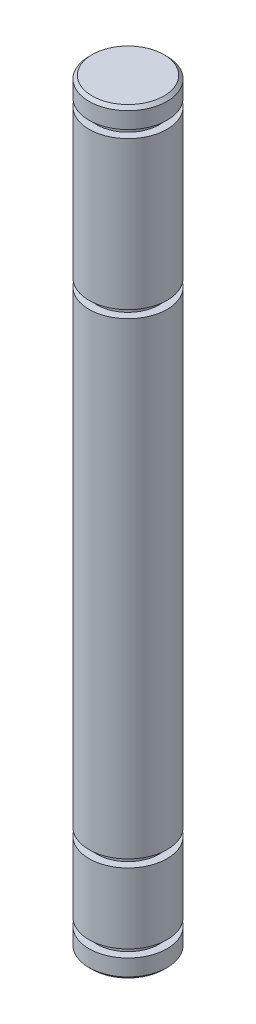
ISO-10303-21;
HEADER;
FILE_DESCRIPTION(('STEP AP214'),'2;1');
FILE_NAME('part.step','',(''),(''),'','','');
FILE_SCHEMA(('AUTOMOTIVE_DESIGN { 1 0 10303 214 1 1 1 1 }'));
ENDSEC;
DATA;
#1=APPLICATION_CONTEXT('core data for automotive mechanical design processes');
#2=APPLICATION_PROTOCOL_DEFINITION('international standard','automotive_design',2000,#1);
#3=PRODUCT_CONTEXT('',#1,'mechanical');
#4=PRODUCT('Part','Part','',(#3));
#5=PRODUCT_RELATED_PRODUCT_CATEGORY('part','',(#4));
#6=PRODUCT_DEFINITION_FORMATION('','',#4);
#7=PRODUCT_DEFINITION_CONTEXT('part definition',#1,'design');
#8=PRODUCT_DEFINITION('design','',#6,#7);
#9=PRODUCT_DEFINITION_SHAPE('','',#8);
#10=(LENGTH_UNIT() NAMED_UNIT(*) SI_UNIT(.MILLI.,.METRE.));
#11=(NAMED_UNIT(*) PLANE_ANGLE_UNIT() SI_UNIT($,.RADIAN.));
#12=(NAMED_UNIT(*) SI_UNIT($,.STERADIAN.) SOLID_ANGLE_UNIT());
#13=UNCERTAINTY_MEASURE_WITH_UNIT(LENGTH_MEASURE(1.E-05),#10,'distance_accuracy_value','');
#14=(GEOMETRIC_REPRESENTATION_CONTEXT(3) GLOBAL_UNCERTAINTY_ASSIGNED_CONTEXT((#13)) GLOBAL_UNIT_ASSIGNED_CONTEXT((#10,
#11,#12)) REPRESENTATION_CONTEXT('',''));
#15=CARTESIAN_POINT('',(0.,0.,0.));
#16=DIRECTION('',(0.,0.,1.));
#17=DIRECTION('',(1.,0.,0.));
#18=AXIS2_PLACEMENT_3D('',#15,#16,#17);
#19=CARTESIAN_POINT('',(5.84200000000003,-61.595,0.));
#20=DIRECTION('',(0.,-1.,0.));
#21=DIRECTION('',(1.,0.,0.));
#22=AXIS2_PLACEMENT_3D('',#19,#20,#21);
#23=PLANE('',#22);
#24=CARTESIAN_POINT('',(0.,-61.595,0.));
#25=DIRECTION('',(0.,-1.,0.));
#26=DIRECTION('',(1.,0.,0.));
#27=AXIS2_PLACEMENT_3D('',#24,#25,#26);
#28=CIRCLE('',#27,5.842);
#29=CARTESIAN_POINT('',(5.84200000000003,-61.595,0.));
#30=VERTEX_POINT('',#29);
#31=EDGE_CURVE('E12',#30,#30,#28,.T.);
#32=ORIENTED_EDGE('',*,*,#31,.T.);
#33=EDGE_LOOP('',(#32));
#34=FACE_BOUND('',#33,.T.);
#35=ADVANCED_FACE('F39',(#34),#23,.T.);
#36=CARTESIAN_POINT('',(0.,-61.595,0.));
#37=DIRECTION('',(0.,1.,0.));
#38=DIRECTION('',(-1.,0.,0.));
#39=AXIS2_PLACEMENT_3D('',#36,#37,#38);
#40=CONICAL_SURFACE('',#39,5.842,0.785398163397433);
#41=CARTESIAN_POINT('',(0.,-61.087,0.));
#42=DIRECTION('',(0.,-1.,0.));
#43=DIRECTION('',(1.,0.,0.));
#44=AXIS2_PLACEMENT_3D('',#41,#42,#43);
#45=CIRCLE('',#44,6.34999999999999);
#46=CARTESIAN_POINT('',(6.35000000000001,-61.087,0.));
#47=VERTEX_POINT('',#46);
#48=EDGE_CURVE('E45',#47,#47,#45,.T.);
#49=ORIENTED_EDGE('',*,*,#48,.T.);
#50=EDGE_LOOP('',(#49));
#51=FACE_BOUND('',#50,.T.);
#52=ORIENTED_EDGE('',*,*,#31,.F.);
#53=EDGE_LOOP('',(#52));
#54=FACE_BOUND('',#53,.T.);
#55=ADVANCED_FACE('F119',(#51,#54),#40,.T.);
#56=CARTESIAN_POINT('',(0.,-61.595,0.));
#57=DIRECTION('',(0.,-1.,0.));
#58=DIRECTION('',(1.,0.,0.));
#59=AXIS2_PLACEMENT_3D('',#56,#57,#58);
#60=CYLINDRICAL_SURFACE('',#59,6.34999999999999);
#61=CARTESIAN_POINT('',(0.,-58.42,0.));
#62=DIRECTION('',(0.,-1.,0.));
#63=DIRECTION('',(1.,0.,0.));
#64=AXIS2_PLACEMENT_3D('',#61,#62,#63);
#65=CIRCLE('',#64,6.34999999999999);
#66=CARTESIAN_POINT('',(6.35000000000001,-58.42,0.));
#67=VERTEX_POINT('',#66);
#68=EDGE_CURVE('E49',#67,#67,#65,.T.);
#69=ORIENTED_EDGE('',*,*,#68,.T.);
#70=EDGE_LOOP('',(#69));
#71=FACE_BOUND('',#70,.T.);
#72=ORIENTED_EDGE('',*,*,#48,.F.);
#73=EDGE_LOOP('',(#72));
#74=FACE_BOUND('',#73,.T.);
#75=ADVANCED_FACE('F123',(#71,#74),#60,.T.);
#76=CARTESIAN_POINT('',(6.35000000000001,-58.42,0.));
#77=DIRECTION('',(0.,1.,0.));
#78=DIRECTION('',(-1.,0.,0.));
#79=AXIS2_PLACEMENT_3D('',#76,#77,#78);
#80=PLANE('',#79);
#81=CARTESIAN_POINT('',(0.,-58.42,0.));
#82=DIRECTION('',(0.,-1.,0.));
#83=DIRECTION('',(1.,0.,0.));
#84=AXIS2_PLACEMENT_3D('',#81,#82,#83);
#85=CIRCLE('',#84,5.07999999999989);
#86=CARTESIAN_POINT('',(5.07999999999991,-58.42,0.));
#87=VERTEX_POINT('',#86);
#88=EDGE_CURVE('E53',#87,#87,#85,.T.);
#89=ORIENTED_EDGE('',*,*,#88,.T.);
#90=EDGE_LOOP('',(#89));
#91=FACE_BOUND('',#90,.T.);
#92=ORIENTED_EDGE('',*,*,#68,.F.);
#93=EDGE_LOOP('',(#92));
#94=FACE_BOUND('',#93,.T.);
#95=ADVANCED_FACE('F127',(#91,#94),#80,.T.);
#96=CARTESIAN_POINT('',(0.,-61.595,0.));
#97=DIRECTION('',(0.,-1.,0.));
#98=DIRECTION('',(1.,0.,0.));
#99=AXIS2_PLACEMENT_3D('',#96,#97,#98);
#100=CYLINDRICAL_SURFACE('',#99,5.07999999999988);
#101=CARTESIAN_POINT('',(0.,-57.15,0.));
#102=DIRECTION('',(0.,-1.,0.));
#103=DIRECTION('',(1.,0.,0.));
#104=AXIS2_PLACEMENT_3D('',#101,#102,#103);
#105=CIRCLE('',#104,5.07999999999989);
#106=CARTESIAN_POINT('',(5.07999999999991,-57.15,0.));
#107=VERTEX_POINT('',#106);
#108=EDGE_CURVE('E58',#107,#107,#105,.T.);
#109=ORIENTED_EDGE('',*,*,#108,.T.);
#110=EDGE_LOOP('',(#109));
#111=FACE_BOUND('',#110,.T.);
#112=ORIENTED_EDGE('',*,*,#88,.F.);
#113=EDGE_LOOP('',(#112));
#114=FACE_BOUND('',#113,.T.);
#115=ADVANCED_FACE('F134',(#111,#114),#100,.T.);
#116=CARTESIAN_POINT('',(6.35000000000001,-57.15,0.));
#117=DIRECTION('',(0.,-1.,0.));
#118=DIRECTION('',(1.,0.,0.));
#119=AXIS2_PLACEMENT_3D('',#116,#117,#118);
#120=PLANE('',#119);
#121=CARTESIAN_POINT('',(0.,-57.15,0.));
#122=DIRECTION('',(0.,-1.,0.));
#123=DIRECTION('',(1.,0.,0.));
#124=AXIS2_PLACEMENT_3D('',#121,#122,#123);
#125=CIRCLE('',#124,6.34999999999999);
#126=CARTESIAN_POINT('',(6.35000000000001,-57.15,0.));
#127=VERTEX_POINT('',#126);
#128=EDGE_CURVE('E61',#127,#127,#125,.T.);
#129=ORIENTED_EDGE('',*,*,#128,.T.);
#130=EDGE_LOOP('',(#129));
#131=FACE_BOUND('',#130,.T.);
#132=ORIENTED_EDGE('',*,*,#108,.F.);
#133=EDGE_LOOP('',(#132));
#134=FACE_BOUND('',#133,.T.);
#135=ADVANCED_FACE('F138',(#131,#134),#120,.T.);
#136=CARTESIAN_POINT('',(0.,-61.595,0.));
#137=DIRECTION('',(0.,-1.,0.));
#138=DIRECTION('',(1.,0.,0.));
#139=AXIS2_PLACEMENT_3D('',#136,#137,#138);
#140=CYLINDRICAL_SURFACE('',#139,6.34999999999999);
#141=CARTESIAN_POINT('',(0.,-45.72,0.));
#142=DIRECTION('',(0.,-1.,0.));
#143=DIRECTION('',(1.,0.,0.));
#144=AXIS2_PLACEMENT_3D('',#141,#142,#143);
#145=CIRCLE('',#144,6.35);
#146=CARTESIAN_POINT('',(6.35000000000003,-45.72,0.));
#147=VERTEX_POINT('',#146);
#148=EDGE_CURVE('E64',#147,#147,#145,.T.);
#149=ORIENTED_EDGE('',*,*,#148,.T.);
#150=EDGE_LOOP('',(#149));
#151=FACE_BOUND('',#150,.T.);
#152=ORIENTED_EDGE('',*,*,#128,.F.);
#153=EDGE_LOOP('',(#152));
#154=FACE_BOUND('',#153,.T.);
#155=ADVANCED_FACE('F142',(#151,#154),#140,.T.);
#156=CARTESIAN_POINT('',(6.35000000000003,-45.72,0.));
#157=DIRECTION('',(0.,1.,0.));
#158=DIRECTION('',(-1.,0.,0.));
#159=AXIS2_PLACEMENT_3D('',#156,#157,#158);
#160=PLANE('',#159);
#161=CARTESIAN_POINT('',(0.,-45.72,0.));
#162=DIRECTION('',(0.,-1.,0.));
#163=DIRECTION('',(1.,0.,0.));
#164=AXIS2_PLACEMENT_3D('',#161,#162,#163);
#165=CIRCLE('',#164,5.07999999999989);
#166=CARTESIAN_POINT('',(5.07999999999991,-45.72,0.));
#167=VERTEX_POINT('',#166);
#168=EDGE_CURVE('E67',#167,#167,#165,.T.);
#169=ORIENTED_EDGE('',*,*,#168,.T.);
#170=EDGE_LOOP('',(#169));
#171=FACE_BOUND('',#170,.T.);
#172=ORIENTED_EDGE('',*,*,#148,.F.);
#173=EDGE_LOOP('',(#172));
#174=FACE_BOUND('',#173,.T.);
#175=ADVANCED_FACE('F146',(#171,#174),#160,.T.);
#176=CARTESIAN_POINT('',(0.,-61.595,0.));
#177=DIRECTION('',(0.,-1.,0.));
#178=DIRECTION('',(1.,0.,0.));
#179=AXIS2_PLACEMENT_3D('',#176,#177,#178);
#180=CYLINDRICAL_SURFACE('',#179,5.07999999999989);
#181=CARTESIAN_POINT('',(0.,-44.45,0.));
#182=DIRECTION('',(0.,-1.,0.));
#183=DIRECTION('',(1.,0.,0.));
#184=AXIS2_PLACEMENT_3D('',#181,#182,#183);
#185=CIRCLE('',#184,5.07999999999989);
#186=CARTESIAN_POINT('',(5.07999999999991,-44.45,0.));
#187=VERTEX_POINT('',#186);
#188=EDGE_CURVE('E70',#187,#187,#185,.T.);
#189=ORIENTED_EDGE('',*,*,#188,.T.);
#190=EDGE_LOOP('',(#189));
#191=FACE_BOUND('',#190,.T.);
#192=ORIENTED_EDGE('',*,*,#168,.F.);
#193=EDGE_LOOP('',(#192));
#194=FACE_BOUND('',#193,.T.);
#195=ADVANCED_FACE('F150',(#191,#194),#180,.T.);
#196=CARTESIAN_POINT('',(6.35000000000001,-44.45,0.));
#197=DIRECTION('',(0.,-1.,0.));
#198=DIRECTION('',(1.,0.,0.));
#199=AXIS2_PLACEMENT_3D('',#196,#197,#198);
#200=PLANE('',#199);
#201=CARTESIAN_POINT('',(0.,-44.45,0.));
#202=DIRECTION('',(0.,-1.,0.));
#203=DIRECTION('',(1.,0.,0.));
#204=AXIS2_PLACEMENT_3D('',#201,#202,#203);
#205=CIRCLE('',#204,6.34999999999999);
#206=CARTESIAN_POINT('',(6.35000000000001,-44.45,0.));
#207=VERTEX_POINT('',#206);
#208=EDGE_CURVE('E73',#207,#207,#205,.T.);
#209=ORIENTED_EDGE('',*,*,#208,.T.);
#210=EDGE_LOOP('',(#209));
#211=FACE_BOUND('',#210,.T.);
#212=ORIENTED_EDGE('',*,*,#188,.F.);
#213=EDGE_LOOP('',(#212));
#214=FACE_BOUND('',#213,.T.);
#215=ADVANCED_FACE('F154',(#211,#214),#200,.T.);
#216=CARTESIAN_POINT('',(0.,-61.595,0.));
#217=DIRECTION('',(0.,-1.,0.));
#218=DIRECTION('',(1.,0.,0.));
#219=AXIS2_PLACEMENT_3D('',#216,#217,#218);
#220=CYLINDRICAL_SURFACE('',#219,6.35);
#221=CARTESIAN_POINT('',(0.,31.75,0.));
#222=DIRECTION('',(0.,-1.,0.));
#223=DIRECTION('',(1.,0.,0.));
#224=AXIS2_PLACEMENT_3D('',#221,#222,#223);
#225=CIRCLE('',#224,6.35000000000001);
#226=CARTESIAN_POINT('',(6.35000000000002,31.75,0.));
#227=VERTEX_POINT('',#226);
#228=EDGE_CURVE('E76',#227,#227,#225,.T.);
#229=ORIENTED_EDGE('',*,*,#228,.T.);
#230=EDGE_LOOP('',(#229));
#231=FACE_BOUND('',#230,.T.);
#232=ORIENTED_EDGE('',*,*,#208,.F.);
#233=EDGE_LOOP('',(#232));
#234=FACE_BOUND('',#233,.T.);
#235=ADVANCED_FACE('F158',(#231,#234),#220,.T.);
#236=CARTESIAN_POINT('',(6.35000000000002,31.75,0.));
#237=DIRECTION('',(0.,1.,0.));
#238=DIRECTION('',(-1.,0.,0.));
#239=AXIS2_PLACEMENT_3D('',#236,#237,#238);
#240=PLANE('',#239);
#241=CARTESIAN_POINT('',(0.,31.75,0.));
#242=DIRECTION('',(0.,-1.,0.));
#243=DIRECTION('',(1.,0.,0.));
#244=AXIS2_PLACEMENT_3D('',#241,#242,#243);
#245=CIRCLE('',#244,5.07999999999991);
#246=CARTESIAN_POINT('',(5.07999999999992,31.75,0.));
#247=VERTEX_POINT('',#246);
#248=EDGE_CURVE('E79',#247,#247,#245,.T.);
#249=ORIENTED_EDGE('',*,*,#248,.T.);
#250=EDGE_LOOP('',(#249));
#251=FACE_BOUND('',#250,.T.);
#252=ORIENTED_EDGE('',*,*,#228,.F.);
#253=EDGE_LOOP('',(#252));
#254=FACE_BOUND('',#253,.T.);
#255=ADVANCED_FACE('F162',(#251,#254),#240,.T.);
#256=CARTESIAN_POINT('',(0.,-61.595,0.));
#257=DIRECTION('',(0.,-1.,0.));
#258=DIRECTION('',(1.,0.,0.));
#259=AXIS2_PLACEMENT_3D('',#256,#257,#258);
#260=CYLINDRICAL_SURFACE('',#259,5.07999999999991);
#261=CARTESIAN_POINT('',(0.,33.02,0.));
#262=DIRECTION('',(0.,-1.,0.));
#263=DIRECTION('',(1.,0.,0.));
#264=AXIS2_PLACEMENT_3D('',#261,#262,#263);
#265=CIRCLE('',#264,5.07999999999991);
#266=CARTESIAN_POINT('',(5.07999999999992,33.02,0.));
#267=VERTEX_POINT('',#266);
#268=EDGE_CURVE('E82',#267,#267,#265,.T.);
#269=ORIENTED_EDGE('',*,*,#268,.T.);
#270=EDGE_LOOP('',(#269));
#271=FACE_BOUND('',#270,.T.);
#272=ORIENTED_EDGE('',*,*,#248,.F.);
#273=EDGE_LOOP('',(#272));
#274=FACE_BOUND('',#273,.T.);
#275=ADVANCED_FACE('F166',(#271,#274),#260,.T.);
#276=CARTESIAN_POINT('',(6.35000000000002,33.02,0.));
#277=DIRECTION('',(0.,-1.,0.));
#278=DIRECTION('',(1.,0.,0.));
#279=AXIS2_PLACEMENT_3D('',#276,#277,#278);
#280=PLANE('',#279);
#281=CARTESIAN_POINT('',(0.,33.02,0.));
#282=DIRECTION('',(0.,-1.,0.));
#283=DIRECTION('',(1.,0.,0.));
#284=AXIS2_PLACEMENT_3D('',#281,#282,#283);
#285=CIRCLE('',#284,6.35000000000001);
#286=CARTESIAN_POINT('',(6.35000000000002,33.02,0.));
#287=VERTEX_POINT('',#286);
#288=EDGE_CURVE('E85',#287,#287,#285,.T.);
#289=ORIENTED_EDGE('',*,*,#288,.T.);
#290=EDGE_LOOP('',(#289));
#291=FACE_BOUND('',#290,.T.);
#292=ORIENTED_EDGE('',*,*,#268,.F.);
#293=EDGE_LOOP('',(#292));
#294=FACE_BOUND('',#293,.T.);
#295=ADVANCED_FACE('F170',(#291,#294),#280,.T.);
#296=CARTESIAN_POINT('',(0.,-61.595,0.));
#297=DIRECTION('',(0.,-1.,0.));
#298=DIRECTION('',(1.,0.,0.));
#299=AXIS2_PLACEMENT_3D('',#296,#297,#298);
#300=CYLINDRICAL_SURFACE('',#299,6.35000000000001);
#301=CARTESIAN_POINT('',(0.,57.15,0.));
#302=DIRECTION('',(0.,-1.,0.));
#303=DIRECTION('',(1.,0.,0.));
#304=AXIS2_PLACEMENT_3D('',#301,#302,#303);
#305=CIRCLE('',#304,6.35000000000001);
#306=CARTESIAN_POINT('',(6.35000000000002,57.15,0.));
#307=VERTEX_POINT('',#306);
#308=EDGE_CURVE('E88',#307,#307,#305,.T.);
#309=ORIENTED_EDGE('',*,*,#308,.T.);
#310=EDGE_LOOP('',(#309));
#311=FACE_BOUND('',#310,.T.);
#312=ORIENTED_EDGE('',*,*,#288,.F.);
#313=EDGE_LOOP('',(#312));
#314=FACE_BOUND('',#313,.T.);
#315=ADVANCED_FACE('F174',(#311,#314),#300,.T.);
#316=CARTESIAN_POINT('',(6.35000000000002,57.15,0.));
#317=DIRECTION('',(0.,1.,0.));
#318=DIRECTION('',(-1.,0.,0.));
#319=AXIS2_PLACEMENT_3D('',#316,#317,#318);
#320=PLANE('',#319);
#321=CARTESIAN_POINT('',(0.,57.15,0.));
#322=DIRECTION('',(0.,-1.,0.));
#323=DIRECTION('',(1.,0.,0.));
#324=AXIS2_PLACEMENT_3D('',#321,#322,#323);
#325=CIRCLE('',#324,5.07999999999992);
#326=CARTESIAN_POINT('',(5.07999999999992,57.15,0.));
#327=VERTEX_POINT('',#326);
#328=EDGE_CURVE('E91',#327,#327,#325,.T.);
#329=ORIENTED_EDGE('',*,*,#328,.T.);
#330=EDGE_LOOP('',(#329));
#331=FACE_BOUND('',#330,.T.);
#332=ORIENTED_EDGE('',*,*,#308,.F.);
#333=EDGE_LOOP('',(#332));
#334=FACE_BOUND('',#333,.T.);
#335=ADVANCED_FACE('F178',(#331,#334),#320,.T.);
#336=CARTESIAN_POINT('',(0.,-61.595,0.));
#337=DIRECTION('',(0.,-1.,0.));
#338=DIRECTION('',(1.,0.,0.));
#339=AXIS2_PLACEMENT_3D('',#336,#337,#338);
#340=CYLINDRICAL_SURFACE('',#339,5.07999999999992);
#341=CARTESIAN_POINT('',(0.,58.42,0.));
#342=DIRECTION('',(0.,-1.,0.));
#343=DIRECTION('',(1.,0.,0.));
#344=AXIS2_PLACEMENT_3D('',#341,#342,#343);
#345=CIRCLE('',#344,5.07999999999994);
#346=CARTESIAN_POINT('',(5.07999999999994,58.42,0.));
#347=VERTEX_POINT('',#346);
#348=EDGE_CURVE('E94',#347,#347,#345,.T.);
#349=ORIENTED_EDGE('',*,*,#348,.T.);
#350=EDGE_LOOP('',(#349));
#351=FACE_BOUND('',#350,.T.);
#352=ORIENTED_EDGE('',*,*,#328,.F.);
#353=EDGE_LOOP('',(#352));
#354=FACE_BOUND('',#353,.T.);
#355=ADVANCED_FACE('F182',(#351,#354),#340,.T.);
#356=CARTESIAN_POINT('',(6.35000000000002,58.42,0.));
#357=DIRECTION('',(0.,-1.,0.));
#358=DIRECTION('',(1.,0.,0.));
#359=AXIS2_PLACEMENT_3D('',#356,#357,#358);
#360=PLANE('',#359);
#361=CARTESIAN_POINT('',(0.,58.42,0.));
#362=DIRECTION('',(0.,-1.,0.));
#363=DIRECTION('',(1.,0.,0.));
#364=AXIS2_PLACEMENT_3D('',#361,#362,#363);
#365=CIRCLE('',#364,6.35000000000001);
#366=CARTESIAN_POINT('',(6.35000000000002,58.42,0.));
#367=VERTEX_POINT('',#366);
#368=EDGE_CURVE('E97',#367,#367,#365,.T.);
#369=ORIENTED_EDGE('',*,*,#368,.T.);
#370=EDGE_LOOP('',(#369));
#371=FACE_BOUND('',#370,.T.);
#372=ORIENTED_EDGE('',*,*,#348,.F.);
#373=EDGE_LOOP('',(#372));
#374=FACE_BOUND('',#373,.T.);
#375=ADVANCED_FACE('F186',(#371,#374),#360,.T.);
#376=CARTESIAN_POINT('',(0.,-61.595,0.));
#377=DIRECTION('',(0.,-1.,0.));
#378=DIRECTION('',(1.,0.,0.));
#379=AXIS2_PLACEMENT_3D('',#376,#377,#378);
#380=CYLINDRICAL_SURFACE('',#379,6.35000000000002);
#381=CARTESIAN_POINT('',(0.,61.087,0.));
#382=DIRECTION('',(0.,-1.,0.));
#383=DIRECTION('',(1.,0.,0.));
#384=AXIS2_PLACEMENT_3D('',#381,#382,#383);
#385=CIRCLE('',#384,6.35000000000002);
#386=CARTESIAN_POINT('',(6.35000000000002,61.087,0.));
#387=VERTEX_POINT('',#386);
#388=EDGE_CURVE('E100',#387,#387,#385,.T.);
#389=ORIENTED_EDGE('',*,*,#388,.T.);
#390=EDGE_LOOP('',(#389));
#391=FACE_BOUND('',#390,.T.);
#392=ORIENTED_EDGE('',*,*,#368,.F.);
#393=EDGE_LOOP('',(#392));
#394=FACE_BOUND('',#393,.T.);
#395=ADVANCED_FACE('F116',(#391,#394),#380,.T.);
#396=CARTESIAN_POINT('',(0.,61.087,0.));
#397=DIRECTION('',(0.,-1.,0.));
#398=DIRECTION('',(1.,0.,0.));
#399=AXIS2_PLACEMENT_3D('',#396,#397,#398);
#400=CONICAL_SURFACE('',#399,6.35000000000002,0.785398163397461);
#401=CARTESIAN_POINT('',(0.,61.595,0.));
#402=DIRECTION('',(0.,-1.,0.));
#403=DIRECTION('',(1.,0.,0.));
#404=AXIS2_PLACEMENT_3D('',#401,#402,#403);
#405=CIRCLE('',#404,5.84200000000001);
#406=CARTESIAN_POINT('',(5.84200000000001,61.595,0.));
#407=VERTEX_POINT('',#406);
#408=EDGE_CURVE('E103',#407,#407,#405,.T.);
#409=ORIENTED_EDGE('',*,*,#408,.T.);
#410=EDGE_LOOP('',(#409));
#411=FACE_BOUND('',#410,.T.);
#412=ORIENTED_EDGE('',*,*,#388,.F.);
#413=EDGE_LOOP('',(#412));
#414=FACE_BOUND('',#413,.T.);
#415=ADVANCED_FACE('F107',(#411,#414),#400,.T.);
#416=CARTESIAN_POINT('',(5.84200000000001,61.595,0.));
#417=DIRECTION('',(0.,1.,0.));
#418=DIRECTION('',(-1.,0.,0.));
#419=AXIS2_PLACEMENT_3D('',#416,#417,#418);
#420=PLANE('',#419);
#421=ORIENTED_EDGE('',*,*,#408,.F.);
#422=EDGE_LOOP('',(#421));
#423=FACE_BOUND('',#422,.T.);
#424=ADVANCED_FACE('F110',(#423),#420,.T.);
#425=CLOSED_SHELL('',(#35,#55,#75,#95,#115,#135,#155,#175,#195,#215,#235,#255,#275,#295,#315,
#335,#355,#375,#395,#415,#424));
#426=MANIFOLD_SOLID_BREP('B2',#425);
#427=ADVANCED_BREP_SHAPE_REPRESENTATION('',(#18,#426),#14);
#428=SHAPE_DEFINITION_REPRESENTATION(#9,#427);
ENDSEC;
END-ISO-10303-21;
